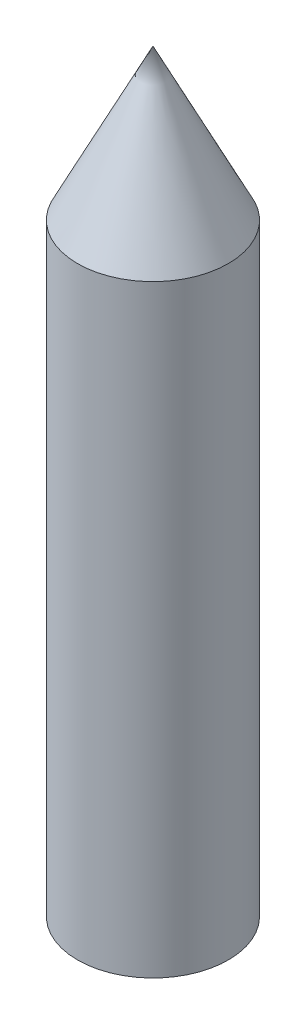
ISO-10303-21;
HEADER;
FILE_DESCRIPTION(('STEP AP214'),'2;1');
FILE_NAME('part.step','',(''),(''),'','','');
FILE_SCHEMA(('AUTOMOTIVE_DESIGN { 1 0 10303 214 1 1 1 1 }'));
ENDSEC;
DATA;
#1=APPLICATION_CONTEXT('core data for automotive mechanical design processes');
#2=APPLICATION_PROTOCOL_DEFINITION('international standard','automotive_design',2000,#1);
#3=PRODUCT_CONTEXT('',#1,'mechanical');
#4=PRODUCT('Part','Part','',(#3));
#5=PRODUCT_RELATED_PRODUCT_CATEGORY('part','',(#4));
#6=PRODUCT_DEFINITION_FORMATION('','',#4);
#7=PRODUCT_DEFINITION_CONTEXT('part definition',#1,'design');
#8=PRODUCT_DEFINITION('design','',#6,#7);
#9=PRODUCT_DEFINITION_SHAPE('','',#8);
#10=(LENGTH_UNIT() NAMED_UNIT(*) SI_UNIT(.MILLI.,.METRE.));
#11=(NAMED_UNIT(*) PLANE_ANGLE_UNIT() SI_UNIT($,.RADIAN.));
#12=(NAMED_UNIT(*) SI_UNIT($,.STERADIAN.) SOLID_ANGLE_UNIT());
#13=UNCERTAINTY_MEASURE_WITH_UNIT(LENGTH_MEASURE(1.E-05),#10,'distance_accuracy_value','');
#14=(GEOMETRIC_REPRESENTATION_CONTEXT(3) GLOBAL_UNCERTAINTY_ASSIGNED_CONTEXT((#13)) GLOBAL_UNIT_ASSIGNED_CONTEXT((#10,
#11,#12)) REPRESENTATION_CONTEXT('',''));
#15=CARTESIAN_POINT('',(0.,0.,0.));
#16=DIRECTION('',(0.,0.,1.));
#17=DIRECTION('',(1.,0.,0.));
#18=AXIS2_PLACEMENT_3D('',#15,#16,#17);
#19=CARTESIAN_POINT('',(0.,50.8,0.));
#20=DIRECTION('',(0.,-1.,0.));
#21=DIRECTION('',(0.,0.,-1.));
#22=AXIS2_PLACEMENT_3D('',#19,#20,#21);
#23=CYLINDRICAL_SURFACE('',#22,6.35);
#24=CARTESIAN_POINT('',(0.,50.8,0.));
#25=DIRECTION('',(0.,1.,0.));
#26=DIRECTION('',(0.,0.,1.));
#27=AXIS2_PLACEMENT_3D('',#24,#25,#26);
#28=CIRCLE('',#27,6.35);
#29=CARTESIAN_POINT('',(0.,50.8,6.35));
#30=VERTEX_POINT('',#29);
#31=EDGE_CURVE('E11',#30,#30,#28,.T.);
#32=ORIENTED_EDGE('',*,*,#31,.F.);
#33=EDGE_LOOP('',(#32));
#34=FACE_BOUND('',#33,.T.);
#35=CARTESIAN_POINT('',(0.,0.,0.));
#36=DIRECTION('',(0.,1.,0.));
#37=DIRECTION('',(0.,0.,1.));
#38=AXIS2_PLACEMENT_3D('',#35,#36,#37);
#39=CIRCLE('',#38,6.35);
#40=CARTESIAN_POINT('',(0.,0.,6.35));
#41=VERTEX_POINT('',#40);
#42=EDGE_CURVE('E40',#41,#41,#39,.T.);
#43=ORIENTED_EDGE('',*,*,#42,.T.);
#44=EDGE_LOOP('',(#43));
#45=FACE_BOUND('',#44,.T.);
#46=ADVANCED_FACE('F37',(#34,#45),#23,.T.);
#47=CARTESIAN_POINT('',(0.,0.,0.));
#48=DIRECTION('',(0.,1.,0.));
#49=DIRECTION('',(0.,0.,1.));
#50=AXIS2_PLACEMENT_3D('',#47,#48,#49);
#51=PLANE('',#50);
#52=ORIENTED_EDGE('',*,*,#42,.F.);
#53=EDGE_LOOP('',(#52));
#54=FACE_BOUND('',#53,.T.);
#55=ADVANCED_FACE('F49',(#54),#51,.F.);
#56=CARTESIAN_POINT('',(0.,50.8,0.));
#57=DIRECTION('',(0.,-1.,0.));
#58=DIRECTION('',(0.,0.,-1.));
#59=AXIS2_PLACEMENT_3D('',#56,#57,#58);
#60=CONICAL_SURFACE('',#59,6.35,0.463647609000806);
#61=CARTESIAN_POINT('',(0.,63.5,0.));
#62=VERTEX_POINT('',#61);
#63=VERTEX_LOOP('',#62);
#64=FACE_BOUND('',#63,.T.);
#65=ORIENTED_EDGE('',*,*,#31,.T.);
#66=EDGE_LOOP('',(#65));
#67=FACE_BOUND('',#66,.T.);
#68=ADVANCED_FACE('F46',(#64,#67),#60,.T.);
#69=CLOSED_SHELL('',(#46,#55,#68));
#70=MANIFOLD_SOLID_BREP('B2',#69);
#71=ADVANCED_BREP_SHAPE_REPRESENTATION('',(#18,#70),#14);
#72=SHAPE_DEFINITION_REPRESENTATION(#9,#71);
ENDSEC;
END-ISO-10303-21;
